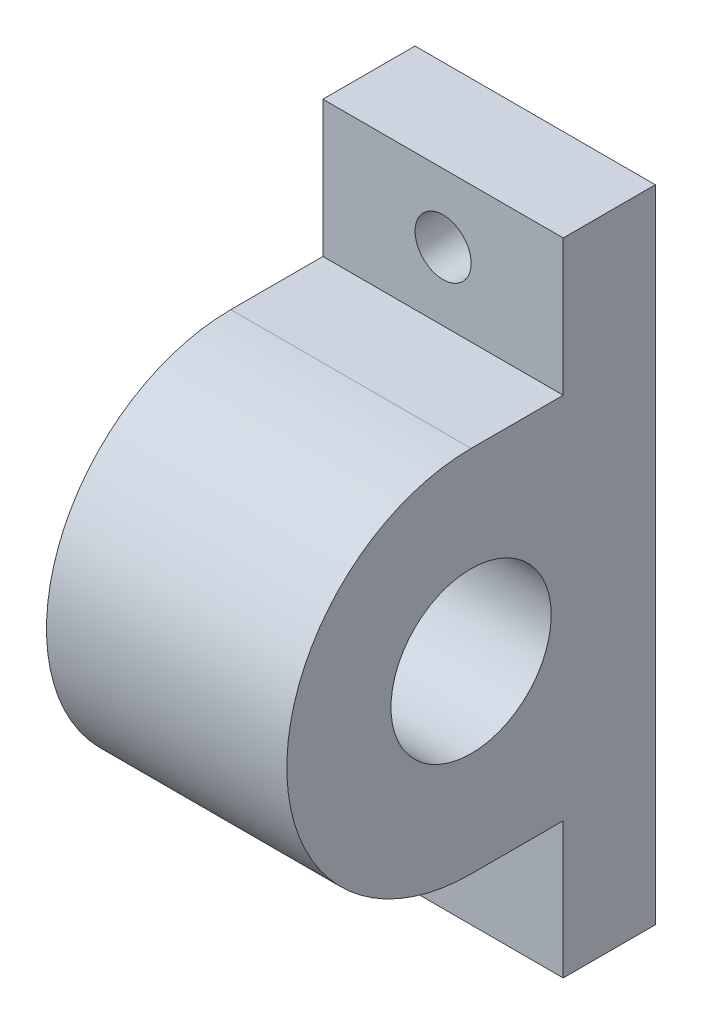
ISO-10303-21;
HEADER;
FILE_DESCRIPTION(('STEP AP214'),'2;1');
FILE_NAME('part.step','',(''),(''),'','','');
FILE_SCHEMA(('AUTOMOTIVE_DESIGN { 1 0 10303 214 1 1 1 1 }'));
ENDSEC;
DATA;
#1=APPLICATION_CONTEXT('core data for automotive mechanical design processes');
#2=APPLICATION_PROTOCOL_DEFINITION('international standard','automotive_design',2000,#1);
#3=PRODUCT_CONTEXT('',#1,'mechanical');
#4=PRODUCT('Part','Part','',(#3));
#5=PRODUCT_RELATED_PRODUCT_CATEGORY('part','',(#4));
#6=PRODUCT_DEFINITION_FORMATION('','',#4);
#7=PRODUCT_DEFINITION_CONTEXT('part definition',#1,'design');
#8=PRODUCT_DEFINITION('design','',#6,#7);
#9=PRODUCT_DEFINITION_SHAPE('','',#8);
#10=(LENGTH_UNIT() NAMED_UNIT(*) SI_UNIT(.MILLI.,.METRE.));
#11=(NAMED_UNIT(*) PLANE_ANGLE_UNIT() SI_UNIT($,.RADIAN.));
#12=(NAMED_UNIT(*) SI_UNIT($,.STERADIAN.) SOLID_ANGLE_UNIT());
#13=UNCERTAINTY_MEASURE_WITH_UNIT(LENGTH_MEASURE(1.E-05),#10,'distance_accuracy_value','');
#14=(GEOMETRIC_REPRESENTATION_CONTEXT(3) GLOBAL_UNCERTAINTY_ASSIGNED_CONTEXT((#13)) GLOBAL_UNIT_ASSIGNED_CONTEXT((#10,
#11,#12)) REPRESENTATION_CONTEXT('',''));
#15=CARTESIAN_POINT('',(0.,0.,0.));
#16=DIRECTION('',(0.,0.,1.));
#17=DIRECTION('',(1.,0.,0.));
#18=AXIS2_PLACEMENT_3D('',#15,#16,#17);
#19=CARTESIAN_POINT('',(235.88115517308,-204.674624292413,23.));
#20=DIRECTION('',(1.,0.,0.));
#21=DIRECTION('',(0.,0.,-1.));
#22=AXIS2_PLACEMENT_3D('',#19,#20,#21);
#23=PLANE('',#22);
#24=CARTESIAN_POINT('',(235.88115517308,-184.674624292413,11.5000000000003));
#25=DIRECTION('',(1.,0.,0.));
#26=DIRECTION('',(0.,0.,-1.));
#27=AXIS2_PLACEMENT_3D('',#24,#25,#26);
#28=CIRCLE('',#27,5.);
#29=CARTESIAN_POINT('',(235.88115517308,-184.674624292413,6.50000000000026));
#30=VERTEX_POINT('',#29);
#31=EDGE_CURVE('E133',#30,#30,#28,.T.);
#32=ORIENTED_EDGE('',*,*,#31,.T.);
#33=EDGE_LOOP('',(#32));
#34=FACE_BOUND('',#33,.T.);
#35=DIRECTION('',(0.,-1.,0.));
#36=VECTOR('',#35,1.);
#37=CARTESIAN_POINT('',(235.88115517308,-173.174624292413,5.75000000000013));
#38=LINE('',#37,#36);
#39=CARTESIAN_POINT('',(235.88115517308,-164.674624292413,5.75000000000013));
#40=VERTEX_POINT('',#39);
#41=CARTESIAN_POINT('',(235.88115517308,-173.174624292413,5.75000000000013));
#42=VERTEX_POINT('',#41);
#43=EDGE_CURVE('E124',#40,#42,#38,.T.);
#44=ORIENTED_EDGE('',*,*,#43,.F.);
#45=DIRECTION('',(0.,0.,-1.));
#46=VECTOR('',#45,1.);
#47=CARTESIAN_POINT('',(235.88115517308,-164.674624292413,23.));
#48=LINE('',#47,#46);
#49=CARTESIAN_POINT('',(235.88115517308,-164.674624292413,0.));
#50=VERTEX_POINT('',#49);
#51=EDGE_CURVE('E56',#40,#50,#48,.T.);
#52=ORIENTED_EDGE('',*,*,#51,.T.);
#53=DIRECTION('',(0.,-1.,0.));
#54=VECTOR('',#53,1.);
#55=CARTESIAN_POINT('',(235.88115517308,-204.674624292413,0.));
#56=LINE('',#55,#54);
#57=CARTESIAN_POINT('',(235.88115517308,-204.674624292413,0.));
#58=VERTEX_POINT('',#57);
#59=EDGE_CURVE('E142',#50,#58,#56,.T.);
#60=ORIENTED_EDGE('',*,*,#59,.T.);
#61=DIRECTION('',(0.,0.,-1.));
#62=VECTOR('',#61,1.);
#63=CARTESIAN_POINT('',(235.88115517308,-204.674624292413,23.));
#64=LINE('',#63,#62);
#65=CARTESIAN_POINT('',(235.88115517308,-204.674624292413,5.75000000000013));
#66=VERTEX_POINT('',#65);
#67=EDGE_CURVE('E12',#66,#58,#64,.T.);
#68=ORIENTED_EDGE('',*,*,#67,.F.);
#69=DIRECTION('',(0.,-1.,0.));
#70=VECTOR('',#69,1.);
#71=CARTESIAN_POINT('',(235.88115517308,-196.174624292413,5.75000000000013));
#72=LINE('',#71,#70);
#73=CARTESIAN_POINT('',(235.88115517308,-196.174624292413,5.75000000000013));
#74=VERTEX_POINT('',#73);
#75=EDGE_CURVE('E122',#74,#66,#72,.T.);
#76=ORIENTED_EDGE('',*,*,#75,.F.);
#77=DIRECTION('',(0.,0.,-1.));
#78=VECTOR('',#77,1.);
#79=CARTESIAN_POINT('',(235.88115517308,-196.174624292413,11.5000000000003));
#80=LINE('',#79,#78);
#81=CARTESIAN_POINT('',(235.88115517308,-196.174624292413,11.5000000000003));
#82=VERTEX_POINT('',#81);
#83=EDGE_CURVE('E109',#82,#74,#80,.T.);
#84=ORIENTED_EDGE('',*,*,#83,.F.);
#85=CARTESIAN_POINT('',(235.88115517308,-184.674624292413,11.5000000000003));
#86=DIRECTION('',(1.,0.,0.));
#87=DIRECTION('',(0.,0.,-1.));
#88=AXIS2_PLACEMENT_3D('',#85,#86,#87);
#89=CIRCLE('',#88,11.4999999999997);
#90=CARTESIAN_POINT('',(235.88115517308,-173.174624292413,11.5000000000003));
#91=VERTEX_POINT('',#90);
#92=EDGE_CURVE('E99',#91,#82,#89,.T.);
#93=ORIENTED_EDGE('',*,*,#92,.F.);
#94=DIRECTION('',(0.,0.,1.));
#95=VECTOR('',#94,1.);
#96=CARTESIAN_POINT('',(235.88115517308,-173.174624292413,11.5000000000003));
#97=LINE('',#96,#95);
#98=EDGE_CURVE('E119',#42,#91,#97,.T.);
#99=ORIENTED_EDGE('',*,*,#98,.F.);
#100=EDGE_LOOP('',(#44,#52,#60,#68,#76,#84,#93,#99));
#101=FACE_BOUND('',#100,.T.);
#102=ADVANCED_FACE('F34',(#34,#101),#23,.F.);
#103=CARTESIAN_POINT('',(235.88115517308,-204.674624292413,23.));
#104=DIRECTION('',(0.,1.,0.));
#105=DIRECTION('',(-1.,0.,0.));
#106=AXIS2_PLACEMENT_3D('',#103,#104,#105);
#107=PLANE('',#106);
#108=DIRECTION('',(1.,0.,0.));
#109=VECTOR('',#108,1.);
#110=CARTESIAN_POINT('',(235.88115517308,-204.674624292413,5.75000000000013));
#111=LINE('',#110,#109);
#112=CARTESIAN_POINT('',(250.88115517308,-204.674624292413,5.75000000000013));
#113=VERTEX_POINT('',#112);
#114=EDGE_CURVE('E147',#66,#113,#111,.T.);
#115=ORIENTED_EDGE('',*,*,#114,.F.);
#116=ORIENTED_EDGE('',*,*,#67,.T.);
#117=DIRECTION('',(1.,0.,0.));
#118=VECTOR('',#117,1.);
#119=CARTESIAN_POINT('',(235.88115517308,-204.674624292413,0.));
#120=LINE('',#119,#118);
#121=CARTESIAN_POINT('',(250.88115517308,-204.674624292413,0.));
#122=VERTEX_POINT('',#121);
#123=EDGE_CURVE('E151',#58,#122,#120,.T.);
#124=ORIENTED_EDGE('',*,*,#123,.T.);
#125=DIRECTION('',(0.,0.,-1.));
#126=VECTOR('',#125,1.);
#127=CARTESIAN_POINT('',(250.88115517308,-204.674624292413,23.));
#128=LINE('',#127,#126);
#129=EDGE_CURVE('E41',#113,#122,#128,.T.);
#130=ORIENTED_EDGE('',*,*,#129,.F.);
#131=EDGE_LOOP('',(#115,#116,#124,#130));
#132=FACE_BOUND('',#131,.T.);
#133=ADVANCED_FACE('F171',(#132),#107,.F.);
#134=CARTESIAN_POINT('',(250.88115517308,-204.674624292413,23.));
#135=DIRECTION('',(-1.,0.,0.));
#136=DIRECTION('',(0.,0.,1.));
#137=AXIS2_PLACEMENT_3D('',#134,#135,#136);
#138=PLANE('',#137);
#139=CARTESIAN_POINT('',(250.88115517308,-184.674624292413,11.5000000000003));
#140=DIRECTION('',(1.,0.,0.));
#141=DIRECTION('',(0.,0.,-1.));
#142=AXIS2_PLACEMENT_3D('',#139,#140,#141);
#143=CIRCLE('',#142,5.);
#144=CARTESIAN_POINT('',(250.88115517308,-184.674624292413,6.50000000000026));
#145=VERTEX_POINT('',#144);
#146=EDGE_CURVE('E201',#145,#145,#143,.T.);
#147=ORIENTED_EDGE('',*,*,#146,.F.);
#148=EDGE_LOOP('',(#147));
#149=FACE_BOUND('',#148,.T.);
#150=DIRECTION('',(0.,-1.,0.));
#151=VECTOR('',#150,1.);
#152=CARTESIAN_POINT('',(250.88115517308,-173.174624292413,5.75000000000013));
#153=LINE('',#152,#151);
#154=CARTESIAN_POINT('',(250.88115517308,-164.674624292413,5.75000000000013));
#155=VERTEX_POINT('',#154);
#156=CARTESIAN_POINT('',(250.88115517308,-173.174624292413,5.75000000000013));
#157=VERTEX_POINT('',#156);
#158=EDGE_CURVE('E48',#155,#157,#153,.T.);
#159=ORIENTED_EDGE('',*,*,#158,.T.);
#160=DIRECTION('',(0.,0.,1.));
#161=VECTOR('',#160,1.);
#162=CARTESIAN_POINT('',(250.88115517308,-173.174624292413,11.5000000000003));
#163=LINE('',#162,#161);
#164=CARTESIAN_POINT('',(250.88115517308,-173.174624292413,11.5000000000003));
#165=VERTEX_POINT('',#164);
#166=EDGE_CURVE('E110',#157,#165,#163,.T.);
#167=ORIENTED_EDGE('',*,*,#166,.T.);
#168=CARTESIAN_POINT('',(250.88115517308,-184.674624292413,11.5000000000003));
#169=DIRECTION('',(1.,0.,0.));
#170=DIRECTION('',(0.,0.,-1.));
#171=AXIS2_PLACEMENT_3D('',#168,#169,#170);
#172=CIRCLE('',#171,11.4999999999997);
#173=CARTESIAN_POINT('',(250.88115517308,-196.174624292413,11.5000000000003));
#174=VERTEX_POINT('',#173);
#175=EDGE_CURVE('E131',#165,#174,#172,.T.);
#176=ORIENTED_EDGE('',*,*,#175,.T.);
#177=DIRECTION('',(0.,0.,-1.));
#178=VECTOR('',#177,1.);
#179=CARTESIAN_POINT('',(250.88115517308,-196.174624292413,11.5000000000003));
#180=LINE('',#179,#178);
#181=CARTESIAN_POINT('',(250.88115517308,-196.174624292413,5.75000000000013));
#182=VERTEX_POINT('',#181);
#183=EDGE_CURVE('E117',#174,#182,#180,.T.);
#184=ORIENTED_EDGE('',*,*,#183,.T.);
#185=DIRECTION('',(0.,-1.,0.));
#186=VECTOR('',#185,1.);
#187=CARTESIAN_POINT('',(250.88115517308,-196.174624292413,5.75000000000013));
#188=LINE('',#187,#186);
#189=EDGE_CURVE('E135',#182,#113,#188,.T.);
#190=ORIENTED_EDGE('',*,*,#189,.T.);
#191=ORIENTED_EDGE('',*,*,#129,.T.);
#192=DIRECTION('',(0.,1.,0.));
#193=VECTOR('',#192,1.);
#194=CARTESIAN_POINT('',(250.88115517308,-204.674624292413,0.));
#195=LINE('',#194,#193);
#196=CARTESIAN_POINT('',(250.88115517308,-164.674624292413,0.));
#197=VERTEX_POINT('',#196);
#198=EDGE_CURVE('E154',#122,#197,#195,.T.);
#199=ORIENTED_EDGE('',*,*,#198,.T.);
#200=DIRECTION('',(0.,0.,-1.));
#201=VECTOR('',#200,1.);
#202=CARTESIAN_POINT('',(250.88115517308,-164.674624292413,23.));
#203=LINE('',#202,#201);
#204=EDGE_CURVE('E160',#155,#197,#203,.T.);
#205=ORIENTED_EDGE('',*,*,#204,.F.);
#206=EDGE_LOOP('',(#159,#167,#176,#184,#190,#191,#199,#205));
#207=FACE_BOUND('',#206,.T.);
#208=ADVANCED_FACE('F163',(#149,#207),#138,.F.);
#209=CARTESIAN_POINT('',(235.88115517308,-164.674624292413,23.));
#210=DIRECTION('',(0.,-1.,0.));
#211=DIRECTION('',(0.,0.,-1.));
#212=AXIS2_PLACEMENT_3D('',#209,#210,#211);
#213=PLANE('',#212);
#214=DIRECTION('',(1.,0.,0.));
#215=VECTOR('',#214,1.);
#216=CARTESIAN_POINT('',(235.88115517308,-164.674624292413,5.75000000000013));
#217=LINE('',#216,#215);
#218=EDGE_CURVE('E145',#40,#155,#217,.T.);
#219=ORIENTED_EDGE('',*,*,#218,.T.);
#220=ORIENTED_EDGE('',*,*,#204,.T.);
#221=DIRECTION('',(-1.,0.,0.));
#222=VECTOR('',#221,1.);
#223=CARTESIAN_POINT('',(235.88115517308,-164.674624292413,0.));
#224=LINE('',#223,#222);
#225=EDGE_CURVE('E157',#197,#50,#224,.T.);
#226=ORIENTED_EDGE('',*,*,#225,.T.);
#227=ORIENTED_EDGE('',*,*,#51,.F.);
#228=EDGE_LOOP('',(#219,#220,#226,#227));
#229=FACE_BOUND('',#228,.T.);
#230=ADVANCED_FACE('F176',(#229),#213,.F.);
#231=CARTESIAN_POINT('',(0.,0.,0.));
#232=DIRECTION('',(0.,0.,-1.));
#233=DIRECTION('',(-1.,0.,0.));
#234=AXIS2_PLACEMENT_3D('',#231,#232,#233);
#235=PLANE('',#234);
#236=CARTESIAN_POINT('',(243.38115517308,-200.424624292413,0.));
#237=DIRECTION('',(0.,0.,-1.));
#238=DIRECTION('',(-1.,0.,0.));
#239=AXIS2_PLACEMENT_3D('',#236,#237,#238);
#240=CIRCLE('',#239,1.75000000000001);
#241=CARTESIAN_POINT('',(241.63115517308,-200.424624292413,0.));
#242=VERTEX_POINT('',#241);
#243=EDGE_CURVE('E208',#242,#242,#240,.T.);
#244=ORIENTED_EDGE('',*,*,#243,.F.);
#245=EDGE_LOOP('',(#244));
#246=FACE_BOUND('',#245,.T.);
#247=CARTESIAN_POINT('',(243.38115517308,-168.924624292413,0.));
#248=DIRECTION('',(0.,0.,-1.));
#249=DIRECTION('',(-1.,0.,0.));
#250=AXIS2_PLACEMENT_3D('',#247,#248,#249);
#251=CIRCLE('',#250,1.75000000000001);
#252=CARTESIAN_POINT('',(241.63115517308,-168.924624292413,0.));
#253=VERTEX_POINT('',#252);
#254=EDGE_CURVE('E204',#253,#253,#251,.T.);
#255=ORIENTED_EDGE('',*,*,#254,.F.);
#256=EDGE_LOOP('',(#255));
#257=FACE_BOUND('',#256,.T.);
#258=ORIENTED_EDGE('',*,*,#59,.F.);
#259=ORIENTED_EDGE('',*,*,#225,.F.);
#260=ORIENTED_EDGE('',*,*,#198,.F.);
#261=ORIENTED_EDGE('',*,*,#123,.F.);
#262=EDGE_LOOP('',(#258,#259,#260,#261));
#263=FACE_BOUND('',#262,.T.);
#264=ADVANCED_FACE('F174',(#246,#257,#263),#235,.T.);
#265=CARTESIAN_POINT('',(235.88115517308,-184.674624292413,11.5000000000003));
#266=DIRECTION('',(1.,0.,0.));
#267=DIRECTION('',(0.,0.,-1.));
#268=AXIS2_PLACEMENT_3D('',#265,#266,#267);
#269=CYLINDRICAL_SURFACE('',#268,11.4999999999997);
#270=DIRECTION('',(1.,0.,0.));
#271=VECTOR('',#270,1.);
#272=CARTESIAN_POINT('',(235.88115517308,-173.174624292413,11.5000000000003));
#273=LINE('',#272,#271);
#274=EDGE_CURVE('E105',#91,#165,#273,.T.);
#275=ORIENTED_EDGE('',*,*,#274,.F.);
#276=ORIENTED_EDGE('',*,*,#92,.T.);
#277=DIRECTION('',(1.,0.,0.));
#278=VECTOR('',#277,1.);
#279=CARTESIAN_POINT('',(235.88115517308,-196.174624292413,11.5000000000003));
#280=LINE('',#279,#278);
#281=EDGE_CURVE('E103',#82,#174,#280,.T.);
#282=ORIENTED_EDGE('',*,*,#281,.T.);
#283=ORIENTED_EDGE('',*,*,#175,.F.);
#284=EDGE_LOOP('',(#275,#276,#282,#283));
#285=FACE_BOUND('',#284,.T.);
#286=ADVANCED_FACE('F101',(#285),#269,.T.);
#287=CARTESIAN_POINT('',(235.88115517308,-173.174624292413,11.5000000000003));
#288=DIRECTION('',(0.,1.,0.));
#289=DIRECTION('',(0.,0.,1.));
#290=AXIS2_PLACEMENT_3D('',#287,#288,#289);
#291=PLANE('',#290);
#292=ORIENTED_EDGE('',*,*,#166,.F.);
#293=DIRECTION('',(1.,0.,0.));
#294=VECTOR('',#293,1.);
#295=CARTESIAN_POINT('',(235.88115517308,-173.174624292413,5.75000000000013));
#296=LINE('',#295,#294);
#297=EDGE_CURVE('E143',#42,#157,#296,.T.);
#298=ORIENTED_EDGE('',*,*,#297,.F.);
#299=ORIENTED_EDGE('',*,*,#98,.T.);
#300=ORIENTED_EDGE('',*,*,#274,.T.);
#301=EDGE_LOOP('',(#292,#298,#299,#300));
#302=FACE_BOUND('',#301,.T.);
#303=ADVANCED_FACE('F179',(#302),#291,.T.);
#304=CARTESIAN_POINT('',(235.88115517308,-173.174624292413,5.75000000000013));
#305=DIRECTION('',(0.,0.,1.));
#306=DIRECTION('',(0.,-1.,0.));
#307=AXIS2_PLACEMENT_3D('',#304,#305,#306);
#308=PLANE('',#307);
#309=CARTESIAN_POINT('',(243.38115517308,-168.924624292413,5.75000000000011));
#310=DIRECTION('',(0.,0.,1.));
#311=DIRECTION('',(1.,0.,0.));
#312=AXIS2_PLACEMENT_3D('',#309,#310,#311);
#313=CIRCLE('',#312,1.75000000000001);
#314=CARTESIAN_POINT('',(245.13115517308,-168.924624292413,5.75000000000011));
#315=VERTEX_POINT('',#314);
#316=EDGE_CURVE('E212',#315,#315,#313,.T.);
#317=ORIENTED_EDGE('',*,*,#316,.F.);
#318=EDGE_LOOP('',(#317));
#319=FACE_BOUND('',#318,.T.);
#320=ORIENTED_EDGE('',*,*,#158,.F.);
#321=ORIENTED_EDGE('',*,*,#218,.F.);
#322=ORIENTED_EDGE('',*,*,#43,.T.);
#323=ORIENTED_EDGE('',*,*,#297,.T.);
#324=EDGE_LOOP('',(#320,#321,#322,#323));
#325=FACE_BOUND('',#324,.T.);
#326=ADVANCED_FACE('F180',(#319,#325),#308,.T.);
#327=CARTESIAN_POINT('',(235.88115517308,-196.174624292413,5.75000000000013));
#328=DIRECTION('',(0.,0.,1.));
#329=DIRECTION('',(0.,-1.,0.));
#330=AXIS2_PLACEMENT_3D('',#327,#328,#329);
#331=PLANE('',#330);
#332=CARTESIAN_POINT('',(243.38115517308,-200.424624292413,5.75000000000011));
#333=DIRECTION('',(0.,0.,1.));
#334=DIRECTION('',(1.,0.,0.));
#335=AXIS2_PLACEMENT_3D('',#332,#333,#334);
#336=CIRCLE('',#335,1.75000000000001);
#337=CARTESIAN_POINT('',(245.13115517308,-200.424624292413,5.75000000000011));
#338=VERTEX_POINT('',#337);
#339=EDGE_CURVE('E211',#338,#338,#336,.T.);
#340=ORIENTED_EDGE('',*,*,#339,.F.);
#341=EDGE_LOOP('',(#340));
#342=FACE_BOUND('',#341,.T.);
#343=ORIENTED_EDGE('',*,*,#189,.F.);
#344=DIRECTION('',(1.,0.,0.));
#345=VECTOR('',#344,1.);
#346=CARTESIAN_POINT('',(235.88115517308,-196.174624292413,5.75000000000013));
#347=LINE('',#346,#345);
#348=EDGE_CURVE('E118',#74,#182,#347,.T.);
#349=ORIENTED_EDGE('',*,*,#348,.F.);
#350=ORIENTED_EDGE('',*,*,#75,.T.);
#351=ORIENTED_EDGE('',*,*,#114,.T.);
#352=EDGE_LOOP('',(#343,#349,#350,#351));
#353=FACE_BOUND('',#352,.T.);
#354=ADVANCED_FACE('F182',(#342,#353),#331,.T.);
#355=CARTESIAN_POINT('',(235.88115517308,-196.174624292413,11.5000000000003));
#356=DIRECTION('',(0.,-1.,0.));
#357=DIRECTION('',(0.,0.,-1.));
#358=AXIS2_PLACEMENT_3D('',#355,#356,#357);
#359=PLANE('',#358);
#360=ORIENTED_EDGE('',*,*,#183,.F.);
#361=ORIENTED_EDGE('',*,*,#281,.F.);
#362=ORIENTED_EDGE('',*,*,#83,.T.);
#363=ORIENTED_EDGE('',*,*,#348,.T.);
#364=EDGE_LOOP('',(#360,#361,#362,#363));
#365=FACE_BOUND('',#364,.T.);
#366=ADVANCED_FACE('F114',(#365),#359,.T.);
#367=CARTESIAN_POINT('',(235.88115517308,-184.674624292413,11.5000000000003));
#368=DIRECTION('',(1.,0.,0.));
#369=DIRECTION('',(0.,0.,-1.));
#370=AXIS2_PLACEMENT_3D('',#367,#368,#369);
#371=CYLINDRICAL_SURFACE('',#370,5.);
#372=ORIENTED_EDGE('',*,*,#31,.F.);
#373=EDGE_LOOP('',(#372));
#374=FACE_BOUND('',#373,.T.);
#375=ORIENTED_EDGE('',*,*,#146,.T.);
#376=EDGE_LOOP('',(#375));
#377=FACE_BOUND('',#376,.T.);
#378=ADVANCED_FACE('F222',(#374,#377),#371,.F.);
#379=CARTESIAN_POINT('',(243.38115517308,-200.424624292413,-11.2499999999999));
#380=DIRECTION('',(0.,0.,1.));
#381=DIRECTION('',(1.,0.,0.));
#382=AXIS2_PLACEMENT_3D('',#379,#380,#381);
#383=CYLINDRICAL_SURFACE('',#382,1.75000000000001);
#384=ORIENTED_EDGE('',*,*,#243,.T.);
#385=EDGE_LOOP('',(#384));
#386=FACE_BOUND('',#385,.T.);
#387=ORIENTED_EDGE('',*,*,#339,.T.);
#388=EDGE_LOOP('',(#387));
#389=FACE_BOUND('',#388,.T.);
#390=ADVANCED_FACE('F218',(#386,#389),#383,.F.);
#391=CARTESIAN_POINT('',(243.38115517308,-168.924624292413,-11.2499999999999));
#392=DIRECTION('',(0.,0.,1.));
#393=DIRECTION('',(1.,0.,0.));
#394=AXIS2_PLACEMENT_3D('',#391,#392,#393);
#395=CYLINDRICAL_SURFACE('',#394,1.75000000000001);
#396=ORIENTED_EDGE('',*,*,#254,.T.);
#397=EDGE_LOOP('',(#396));
#398=FACE_BOUND('',#397,.T.);
#399=ORIENTED_EDGE('',*,*,#316,.T.);
#400=EDGE_LOOP('',(#399));
#401=FACE_BOUND('',#400,.T.);
#402=ADVANCED_FACE('F221',(#398,#401),#395,.F.);
#403=CLOSED_SHELL('',(#102,#133,#208,#230,#264,#286,#303,#326,#354,#366,#378,#390,#402));
#404=MANIFOLD_SOLID_BREP('B2',#403);
#405=ADVANCED_BREP_SHAPE_REPRESENTATION('',(#18,#404),#14);
#406=SHAPE_DEFINITION_REPRESENTATION(#9,#405);
ENDSEC;
END-ISO-10303-21;
